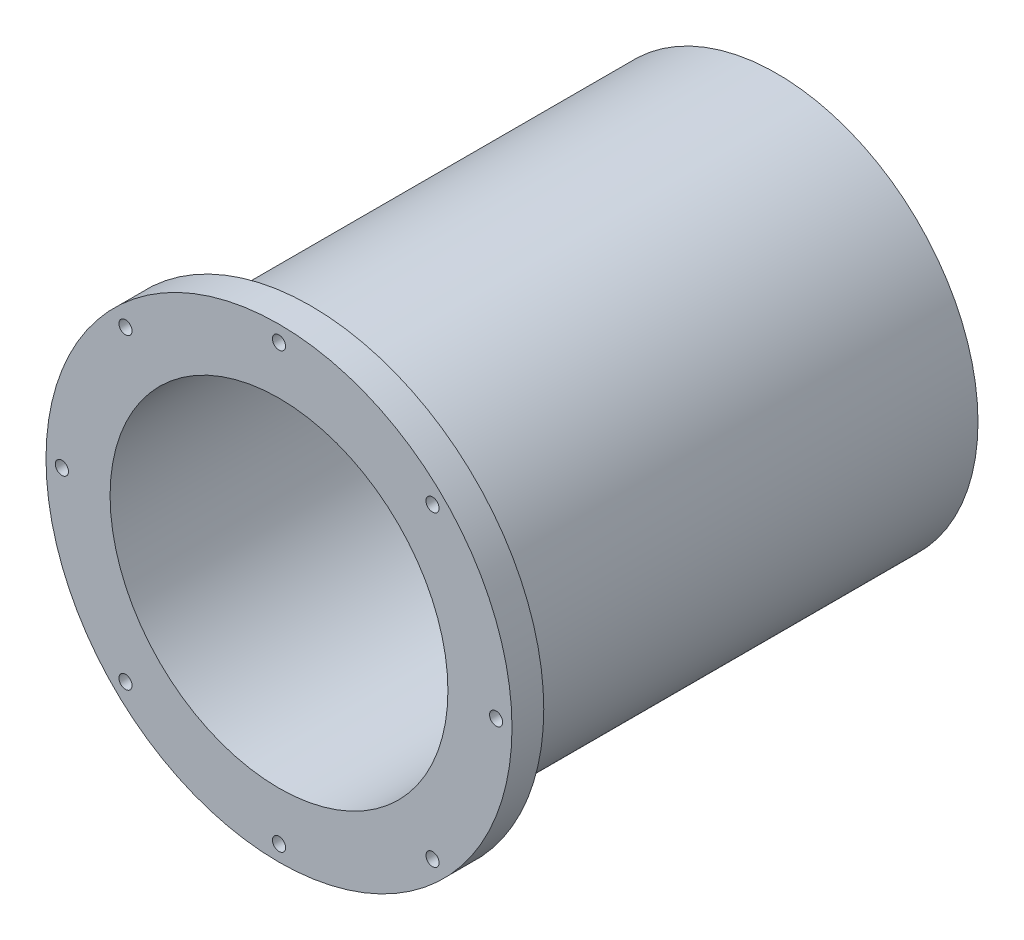
ISO-10303-21;
HEADER;
FILE_DESCRIPTION(('STEP AP214'),'2;1');
FILE_NAME('part.step','',(''),(''),'','','');
FILE_SCHEMA(('AUTOMOTIVE_DESIGN { 1 0 10303 214 1 1 1 1 }'));
ENDSEC;
DATA;
#1=APPLICATION_CONTEXT('core data for automotive mechanical design processes');
#2=APPLICATION_PROTOCOL_DEFINITION('international standard','automotive_design',2000,#1);
#3=PRODUCT_CONTEXT('',#1,'mechanical');
#4=PRODUCT('Part','Part','',(#3));
#5=PRODUCT_RELATED_PRODUCT_CATEGORY('part','',(#4));
#6=PRODUCT_DEFINITION_FORMATION('','',#4);
#7=PRODUCT_DEFINITION_CONTEXT('part definition',#1,'design');
#8=PRODUCT_DEFINITION('design','',#6,#7);
#9=PRODUCT_DEFINITION_SHAPE('','',#8);
#10=(LENGTH_UNIT() NAMED_UNIT(*) SI_UNIT(.MILLI.,.METRE.));
#11=(NAMED_UNIT(*) PLANE_ANGLE_UNIT() SI_UNIT($,.RADIAN.));
#12=(NAMED_UNIT(*) SI_UNIT($,.STERADIAN.) SOLID_ANGLE_UNIT());
#13=UNCERTAINTY_MEASURE_WITH_UNIT(LENGTH_MEASURE(1.E-05),#10,'distance_accuracy_value','');
#14=(GEOMETRIC_REPRESENTATION_CONTEXT(3) GLOBAL_UNCERTAINTY_ASSIGNED_CONTEXT((#13)) GLOBAL_UNIT_ASSIGNED_CONTEXT((#10,
#11,#12)) REPRESENTATION_CONTEXT('',''));
#15=CARTESIAN_POINT('',(0.,0.,0.));
#16=DIRECTION('',(0.,0.,1.));
#17=DIRECTION('',(1.,0.,0.));
#18=AXIS2_PLACEMENT_3D('',#15,#16,#17);
#19=CARTESIAN_POINT('',(0.,0.,11.));
#20=DIRECTION('',(0.,0.,-1.));
#21=DIRECTION('',(-1.,0.,0.));
#22=AXIS2_PLACEMENT_3D('',#19,#20,#21);
#23=CYLINDRICAL_SURFACE('',#22,55.);
#24=CARTESIAN_POINT('',(0.,0.,11.));
#25=DIRECTION('',(0.,0.,1.));
#26=DIRECTION('',(1.,0.,0.));
#27=AXIS2_PLACEMENT_3D('',#24,#25,#26);
#28=CIRCLE('',#27,55.);
#29=CARTESIAN_POINT('',(55.,0.,11.));
#30=VERTEX_POINT('',#29);
#31=EDGE_CURVE('E11',#30,#30,#28,.T.);
#32=ORIENTED_EDGE('',*,*,#31,.F.);
#33=EDGE_LOOP('',(#32));
#34=FACE_BOUND('',#33,.T.);
#35=CARTESIAN_POINT('',(0.,0.,3.5));
#36=DIRECTION('',(0.,0.,-1.));
#37=DIRECTION('',(-1.,0.,0.));
#38=AXIS2_PLACEMENT_3D('',#35,#36,#37);
#39=CIRCLE('',#38,55.);
#40=CARTESIAN_POINT('',(-55.,0.,3.5));
#41=VERTEX_POINT('',#40);
#42=EDGE_CURVE('E41',#41,#41,#39,.T.);
#43=ORIENTED_EDGE('',*,*,#42,.F.);
#44=EDGE_LOOP('',(#43));
#45=FACE_BOUND('',#44,.T.);
#46=ADVANCED_FACE('F36',(#34,#45),#23,.T.);
#47=CARTESIAN_POINT('',(0.,0.,11.));
#48=DIRECTION('',(0.,0.,1.));
#49=DIRECTION('',(1.,0.,0.));
#50=AXIS2_PLACEMENT_3D('',#47,#48,#49);
#51=PLANE('',#50);
#52=CARTESIAN_POINT('',(0.,0.,11.));
#53=DIRECTION('',(0.,0.,1.));
#54=DIRECTION('',(1.,0.,0.));
#55=AXIS2_PLACEMENT_3D('',#52,#53,#54);
#56=CIRCLE('',#55,39.875);
#57=CARTESIAN_POINT('',(39.875,0.,11.));
#58=VERTEX_POINT('',#57);
#59=EDGE_CURVE('E91',#58,#58,#56,.T.);
#60=ORIENTED_EDGE('',*,*,#59,.F.);
#61=EDGE_LOOP('',(#60));
#62=FACE_BOUND('',#61,.T.);
#63=CARTESIAN_POINT('',(51.25,-1.78938418615711E-13,11.));
#64=DIRECTION('',(0.,0.,-1.));
#65=DIRECTION('',(0.,1.,0.));
#66=AXIS2_PLACEMENT_3D('',#63,#64,#65);
#67=CIRCLE('',#66,1.55);
#68=CARTESIAN_POINT('',(51.25,1.54999999999982,11.));
#69=VERTEX_POINT('',#68);
#70=EDGE_CURVE('E65',#69,#69,#67,.T.);
#71=ORIENTED_EDGE('',*,*,#70,.T.);
#72=EDGE_LOOP('',(#71));
#73=FACE_BOUND('',#72,.T.);
#74=CARTESIAN_POINT('',(36.2392225358104,-36.2392225358108,11.));
#75=DIRECTION('',(0.,0.,-1.));
#76=DIRECTION('',(0.707106781186551,0.707106781186544,0.));
#77=AXIS2_PLACEMENT_3D('',#74,#75,#76);
#78=CIRCLE('',#77,1.55);
#79=CARTESIAN_POINT('',(37.3352380466495,-35.1432070249716,11.));
#80=VERTEX_POINT('',#79);
#81=EDGE_CURVE('E82',#80,#80,#78,.T.);
#82=ORIENTED_EDGE('',*,*,#81,.T.);
#83=EDGE_LOOP('',(#82));
#84=FACE_BOUND('',#83,.T.);
#85=CARTESIAN_POINT('',(0.,-51.25,11.));
#86=DIRECTION('',(0.,0.,-1.));
#87=DIRECTION('',(1.,0.,0.));
#88=AXIS2_PLACEMENT_3D('',#85,#86,#87);
#89=CIRCLE('',#88,1.55);
#90=CARTESIAN_POINT('',(1.55,-51.25,11.));
#91=VERTEX_POINT('',#90);
#92=EDGE_CURVE('E73',#91,#91,#89,.T.);
#93=ORIENTED_EDGE('',*,*,#92,.T.);
#94=EDGE_LOOP('',(#93));
#95=FACE_BOUND('',#94,.T.);
#96=CARTESIAN_POINT('',(-36.2392225358109,-36.2392225358102,11.));
#97=DIRECTION('',(0.,0.,-1.));
#98=DIRECTION('',(0.707106781186541,-0.707106781186554,0.));
#99=AXIS2_PLACEMENT_3D('',#96,#97,#98);
#100=CIRCLE('',#99,1.55);
#101=CARTESIAN_POINT('',(-35.1432070249717,-37.3352380466494,11.));
#102=VERTEX_POINT('',#101);
#103=EDGE_CURVE('E68',#102,#102,#100,.T.);
#104=ORIENTED_EDGE('',*,*,#103,.T.);
#105=EDGE_LOOP('',(#104));
#106=FACE_BOUND('',#105,.T.);
#107=CARTESIAN_POINT('',(-51.25,5.36815255847132E-13,11.));
#108=DIRECTION('',(0.,0.,-1.));
#109=DIRECTION('',(0.,-1.,0.));
#110=AXIS2_PLACEMENT_3D('',#107,#108,#109);
#111=CIRCLE('',#110,1.55);
#112=CARTESIAN_POINT('',(-51.25,-1.54999999999946,11.));
#113=VERTEX_POINT('',#112);
#114=EDGE_CURVE('E69',#113,#113,#111,.T.);
#115=ORIENTED_EDGE('',*,*,#114,.T.);
#116=EDGE_LOOP('',(#115));
#117=FACE_BOUND('',#116,.T.);
#118=CARTESIAN_POINT('',(-36.2392225358101,36.239222535811,11.));
#119=DIRECTION('',(0.,0.,-1.));
#120=DIRECTION('',(-0.707106781186556,-0.707106781186539,0.));
#121=AXIS2_PLACEMENT_3D('',#118,#119,#120);
#122=CIRCLE('',#121,1.55);
#123=CARTESIAN_POINT('',(-37.3352380466493,35.1432070249719,11.));
#124=VERTEX_POINT('',#123);
#125=EDGE_CURVE('E95',#124,#124,#122,.T.);
#126=ORIENTED_EDGE('',*,*,#125,.T.);
#127=EDGE_LOOP('',(#126));
#128=FACE_BOUND('',#127,.T.);
#129=CARTESIAN_POINT('',(36.2392225358106,36.2392225358105,11.));
#130=DIRECTION('',(0.,0.,-1.));
#131=DIRECTION('',(-0.707106781186546,0.707106781186549,0.));
#132=AXIS2_PLACEMENT_3D('',#129,#130,#131);
#133=CIRCLE('',#132,1.55);
#134=CARTESIAN_POINT('',(35.1432070249715,37.3352380466497,11.));
#135=VERTEX_POINT('',#134);
#136=EDGE_CURVE('E57',#135,#135,#133,.T.);
#137=ORIENTED_EDGE('',*,*,#136,.T.);
#138=EDGE_LOOP('',(#137));
#139=FACE_BOUND('',#138,.T.);
#140=CARTESIAN_POINT('',(0.,51.25,11.));
#141=DIRECTION('',(0.,0.,-1.));
#142=DIRECTION('',(-1.,0.,0.));
#143=AXIS2_PLACEMENT_3D('',#140,#141,#142);
#144=CIRCLE('',#143,1.55);
#145=CARTESIAN_POINT('',(-1.55,51.25,11.));
#146=VERTEX_POINT('',#145);
#147=EDGE_CURVE('E55',#146,#146,#144,.T.);
#148=ORIENTED_EDGE('',*,*,#147,.T.);
#149=EDGE_LOOP('',(#148));
#150=FACE_BOUND('',#149,.T.);
#151=ORIENTED_EDGE('',*,*,#31,.T.);
#152=EDGE_LOOP('',(#151));
#153=FACE_BOUND('',#152,.T.);
#154=ADVANCED_FACE('F123',(#62,#73,#84,#95,#106,#117,#128,#139,#150,#153),#51,.T.);
#155=CARTESIAN_POINT('',(0.,0.,3.5));
#156=DIRECTION('',(0.,0.,-1.));
#157=DIRECTION('',(-1.,0.,0.));
#158=AXIS2_PLACEMENT_3D('',#155,#156,#157);
#159=PLANE('',#158);
#160=CARTESIAN_POINT('',(51.25,-1.78938418615711E-13,3.5));
#161=DIRECTION('',(0.,0.,-1.));
#162=DIRECTION('',(0.,1.,0.));
#163=AXIS2_PLACEMENT_3D('',#160,#161,#162);
#164=CIRCLE('',#163,1.55);
#165=CARTESIAN_POINT('',(51.25,1.54999999999982,3.5));
#166=VERTEX_POINT('',#165);
#167=EDGE_CURVE('E84',#166,#166,#164,.T.);
#168=ORIENTED_EDGE('',*,*,#167,.F.);
#169=EDGE_LOOP('',(#168));
#170=FACE_BOUND('',#169,.T.);
#171=CARTESIAN_POINT('',(36.2392225358104,-36.2392225358108,3.5));
#172=DIRECTION('',(0.,0.,-1.));
#173=DIRECTION('',(0.707106781186551,0.707106781186544,0.));
#174=AXIS2_PLACEMENT_3D('',#171,#172,#173);
#175=CIRCLE('',#174,1.55);
#176=CARTESIAN_POINT('',(37.3352380466495,-35.1432070249716,3.5));
#177=VERTEX_POINT('',#176);
#178=EDGE_CURVE('E78',#177,#177,#175,.T.);
#179=ORIENTED_EDGE('',*,*,#178,.F.);
#180=EDGE_LOOP('',(#179));
#181=FACE_BOUND('',#180,.T.);
#182=CARTESIAN_POINT('',(0.,-51.25,3.5));
#183=DIRECTION('',(0.,0.,-1.));
#184=DIRECTION('',(1.,0.,0.));
#185=AXIS2_PLACEMENT_3D('',#182,#183,#184);
#186=CIRCLE('',#185,1.55);
#187=CARTESIAN_POINT('',(1.55,-51.25,3.5));
#188=VERTEX_POINT('',#187);
#189=EDGE_CURVE('E75',#188,#188,#186,.T.);
#190=ORIENTED_EDGE('',*,*,#189,.F.);
#191=EDGE_LOOP('',(#190));
#192=FACE_BOUND('',#191,.T.);
#193=CARTESIAN_POINT('',(-36.2392225358109,-36.2392225358102,3.5));
#194=DIRECTION('',(0.,0.,-1.));
#195=DIRECTION('',(0.707106781186541,-0.707106781186554,0.));
#196=AXIS2_PLACEMENT_3D('',#193,#194,#195);
#197=CIRCLE('',#196,1.55);
#198=CARTESIAN_POINT('',(-35.1432070249717,-37.3352380466494,3.5));
#199=VERTEX_POINT('',#198);
#200=EDGE_CURVE('E61',#199,#199,#197,.T.);
#201=ORIENTED_EDGE('',*,*,#200,.F.);
#202=EDGE_LOOP('',(#201));
#203=FACE_BOUND('',#202,.T.);
#204=CARTESIAN_POINT('',(-51.25,5.36815255847132E-13,3.5));
#205=DIRECTION('',(0.,0.,-1.));
#206=DIRECTION('',(0.,-1.,0.));
#207=AXIS2_PLACEMENT_3D('',#204,#205,#206);
#208=CIRCLE('',#207,1.55);
#209=CARTESIAN_POINT('',(-51.25,-1.54999999999946,3.5));
#210=VERTEX_POINT('',#209);
#211=EDGE_CURVE('E96',#210,#210,#208,.T.);
#212=ORIENTED_EDGE('',*,*,#211,.F.);
#213=EDGE_LOOP('',(#212));
#214=FACE_BOUND('',#213,.T.);
#215=CARTESIAN_POINT('',(-36.2392225358101,36.239222535811,3.5));
#216=DIRECTION('',(0.,0.,-1.));
#217=DIRECTION('',(-0.707106781186556,-0.707106781186539,0.));
#218=AXIS2_PLACEMENT_3D('',#215,#216,#217);
#219=CIRCLE('',#218,1.55);
#220=CARTESIAN_POINT('',(-37.3352380466493,35.1432070249719,3.5));
#221=VERTEX_POINT('',#220);
#222=EDGE_CURVE('E90',#221,#221,#219,.T.);
#223=ORIENTED_EDGE('',*,*,#222,.F.);
#224=EDGE_LOOP('',(#223));
#225=FACE_BOUND('',#224,.T.);
#226=CARTESIAN_POINT('',(36.2392225358106,36.2392225358105,3.5));
#227=DIRECTION('',(0.,0.,-1.));
#228=DIRECTION('',(-0.707106781186546,0.707106781186549,0.));
#229=AXIS2_PLACEMENT_3D('',#226,#227,#228);
#230=CIRCLE('',#229,1.55);
#231=CARTESIAN_POINT('',(35.1432070249715,37.3352380466497,3.5));
#232=VERTEX_POINT('',#231);
#233=EDGE_CURVE('E56',#232,#232,#230,.T.);
#234=ORIENTED_EDGE('',*,*,#233,.F.);
#235=EDGE_LOOP('',(#234));
#236=FACE_BOUND('',#235,.T.);
#237=CARTESIAN_POINT('',(0.,51.25,3.5));
#238=DIRECTION('',(0.,0.,-1.));
#239=DIRECTION('',(-1.,0.,0.));
#240=AXIS2_PLACEMENT_3D('',#237,#238,#239);
#241=CIRCLE('',#240,1.55);
#242=CARTESIAN_POINT('',(-1.55,51.25,3.5));
#243=VERTEX_POINT('',#242);
#244=EDGE_CURVE('E52',#243,#243,#241,.T.);
#245=ORIENTED_EDGE('',*,*,#244,.F.);
#246=EDGE_LOOP('',(#245));
#247=FACE_BOUND('',#246,.T.);
#248=CARTESIAN_POINT('',(0.,0.,3.5));
#249=DIRECTION('',(0.,0.,-1.));
#250=DIRECTION('',(-1.,0.,0.));
#251=AXIS2_PLACEMENT_3D('',#248,#249,#250);
#252=CIRCLE('',#251,47.5);
#253=CARTESIAN_POINT('',(-47.5,0.,3.5));
#254=VERTEX_POINT('',#253);
#255=EDGE_CURVE('E48',#254,#254,#252,.T.);
#256=ORIENTED_EDGE('',*,*,#255,.F.);
#257=EDGE_LOOP('',(#256));
#258=FACE_BOUND('',#257,.T.);
#259=ORIENTED_EDGE('',*,*,#42,.T.);
#260=EDGE_LOOP('',(#259));
#261=FACE_BOUND('',#260,.T.);
#262=ADVANCED_FACE('F129',(#170,#181,#192,#203,#214,#225,#236,#247,#258,#261),#159,.T.);
#263=CARTESIAN_POINT('',(0.,0.,3.5));
#264=DIRECTION('',(0.,0.,-1.));
#265=DIRECTION('',(-1.,0.,0.));
#266=AXIS2_PLACEMENT_3D('',#263,#264,#265);
#267=CYLINDRICAL_SURFACE('',#266,47.5);
#268=CARTESIAN_POINT('',(0.,0.,-106.5));
#269=DIRECTION('',(0.,0.,-1.));
#270=DIRECTION('',(-1.,0.,0.));
#271=AXIS2_PLACEMENT_3D('',#268,#269,#270);
#272=CIRCLE('',#271,47.5);
#273=CARTESIAN_POINT('',(-47.5,0.,-106.5));
#274=VERTEX_POINT('',#273);
#275=EDGE_CURVE('E103',#274,#274,#272,.T.);
#276=CARTESIAN_POINT('',(-47.5,0.,3.5));
#277=CARTESIAN_POINT('',(-47.5,0.,2.35416666666667));
#278=CARTESIAN_POINT('',(-47.5,0.,1.20833333333334));
#279=CARTESIAN_POINT('',(-47.5,0.,-1.08333333333333));
#280=CARTESIAN_POINT('',(-47.5,0.,-2.22916666666666));
#281=CARTESIAN_POINT('',(-47.5,0.,-4.52083333333333));
#282=CARTESIAN_POINT('',(-47.5,0.,-5.66666666666667));
#283=CARTESIAN_POINT('',(-47.5,0.,-7.95833333333333));
#284=CARTESIAN_POINT('',(-47.5,0.,-9.10416666666666));
#285=CARTESIAN_POINT('',(-47.5,0.,-11.3958333333333));
#286=CARTESIAN_POINT('',(-47.5,0.,-12.5416666666667));
#287=CARTESIAN_POINT('',(-47.5,0.,-14.8333333333333));
#288=CARTESIAN_POINT('',(-47.5,0.,-15.9791666666667));
#289=CARTESIAN_POINT('',(-47.5,0.,-18.2708333333333));
#290=CARTESIAN_POINT('',(-47.5,0.,-19.4166666666667));
#291=CARTESIAN_POINT('',(-47.5,0.,-21.7083333333333));
#292=CARTESIAN_POINT('',(-47.5,0.,-22.8541666666667));
#293=CARTESIAN_POINT('',(-47.5,0.,-25.1458333333333));
#294=CARTESIAN_POINT('',(-47.5,0.,-26.2916666666667));
#295=CARTESIAN_POINT('',(-47.5,0.,-28.5833333333333));
#296=CARTESIAN_POINT('',(-47.5,0.,-29.7291666666667));
#297=CARTESIAN_POINT('',(-47.5,0.,-32.0208333333333));
#298=CARTESIAN_POINT('',(-47.5,0.,-33.1666666666667));
#299=CARTESIAN_POINT('',(-47.5,0.,-35.4583333333333));
#300=CARTESIAN_POINT('',(-47.5,0.,-36.6041666666667));
#301=CARTESIAN_POINT('',(-47.5,0.,-38.8958333333333));
#302=CARTESIAN_POINT('',(-47.5,0.,-40.0416666666667));
#303=CARTESIAN_POINT('',(-47.5,0.,-42.3333333333333));
#304=CARTESIAN_POINT('',(-47.5,0.,-43.4791666666667));
#305=CARTESIAN_POINT('',(-47.5,0.,-45.7708333333333));
#306=CARTESIAN_POINT('',(-47.5,0.,-46.9166666666667));
#307=CARTESIAN_POINT('',(-47.5,0.,-49.2083333333333));
#308=CARTESIAN_POINT('',(-47.5,0.,-50.3541666666667));
#309=CARTESIAN_POINT('',(-47.5,0.,-52.6458333333333));
#310=CARTESIAN_POINT('',(-47.5,0.,-53.7916666666667));
#311=CARTESIAN_POINT('',(-47.5,0.,-56.0833333333333));
#312=CARTESIAN_POINT('',(-47.5,0.,-57.2291666666667));
#313=CARTESIAN_POINT('',(-47.5,0.,-59.5208333333333));
#314=CARTESIAN_POINT('',(-47.5,0.,-60.6666666666667));
#315=CARTESIAN_POINT('',(-47.5,0.,-62.9583333333333));
#316=CARTESIAN_POINT('',(-47.5,0.,-64.1041666666667));
#317=CARTESIAN_POINT('',(-47.5,0.,-66.3958333333333));
#318=CARTESIAN_POINT('',(-47.5,0.,-67.5416666666667));
#319=CARTESIAN_POINT('',(-47.5,0.,-69.8333333333333));
#320=CARTESIAN_POINT('',(-47.5,0.,-70.9791666666667));
#321=CARTESIAN_POINT('',(-47.5,0.,-73.2708333333333));
#322=CARTESIAN_POINT('',(-47.5,0.,-74.4166666666667));
#323=CARTESIAN_POINT('',(-47.5,0.,-76.7083333333333));
#324=CARTESIAN_POINT('',(-47.5,0.,-77.8541666666667));
#325=CARTESIAN_POINT('',(-47.5,0.,-80.1458333333333));
#326=CARTESIAN_POINT('',(-47.5,0.,-81.2916666666667));
#327=CARTESIAN_POINT('',(-47.5,0.,-83.5833333333333));
#328=CARTESIAN_POINT('',(-47.5,0.,-84.7291666666667));
#329=CARTESIAN_POINT('',(-47.5,0.,-87.0208333333333));
#330=CARTESIAN_POINT('',(-47.5,0.,-88.1666666666667));
#331=CARTESIAN_POINT('',(-47.5,0.,-90.4583333333333));
#332=CARTESIAN_POINT('',(-47.5,0.,-91.6041666666667));
#333=CARTESIAN_POINT('',(-47.5,0.,-93.8958333333333));
#334=CARTESIAN_POINT('',(-47.5,0.,-95.0416666666667));
#335=CARTESIAN_POINT('',(-47.5,0.,-97.3333333333333));
#336=CARTESIAN_POINT('',(-47.5,0.,-98.4791666666667));
#337=CARTESIAN_POINT('',(-47.5,0.,-100.770833333333));
#338=CARTESIAN_POINT('',(-47.5,0.,-101.916666666667));
#339=CARTESIAN_POINT('',(-47.5,0.,-104.208333333333));
#340=CARTESIAN_POINT('',(-47.5,0.,-105.354166666667));
#341=CARTESIAN_POINT('',(-47.5,0.,-106.5));
#342=B_SPLINE_CURVE_WITH_KNOTS('',3,(#276,#277,#278,#279,#280,#281,#282,#283,#284,#285,#286,
#287,#288,#289,#290,#291,#292,#293,#294,#295,#296,#297,#298,#299,#300,#301,#302,#303,#304,#305,
#306,#307,#308,#309,#310,#311,#312,#313,#314,#315,#316,#317,#318,#319,#320,#321,#322,#323,#324,
#325,#326,#327,#328,#329,#330,#331,#332,#333,#334,#335,#336,#337,#338,#339,#340,#341),
.UNSPECIFIED.,.F.,.F.,(4,2,2,2,2,2,2,2,2,2,2,2,2,2,2,2,2,2,2,2,2,2,2,2,2,2,2,2,2,2,2,2,4),(0.,
3.4375,6.875,10.3125,13.75,17.1875,20.625,24.0625,27.5,30.9375,34.375,37.8125,41.25,44.6875,
48.125,51.5625,55.,58.4375,61.875,65.3125,68.75,72.1875,75.625,79.0625,82.5,85.9375,89.375,
92.8125,96.25,99.6875,103.125,106.5625,110.),.UNSPECIFIED.);
#343=EDGE_CURVE('BSEAM131',#254,#274,#342,.T.);
#344=ORIENTED_EDGE('',*,*,#255,.T.);
#345=ORIENTED_EDGE('',*,*,#275,.F.);
#346=ORIENTED_EDGE('',*,*,#343,.T.);
#347=ORIENTED_EDGE('',*,*,#343,.F.);
#348=EDGE_LOOP('',(#344,#346,#345,#347));
#349=FACE_BOUND('',#348,.T.);
#350=ADVANCED_FACE('F131',(#349),#267,.T.);
#351=CARTESIAN_POINT('',(0.,51.25,11.));
#352=DIRECTION('',(0.,0.,-1.));
#353=DIRECTION('',(-1.,0.,0.));
#354=AXIS2_PLACEMENT_3D('',#351,#352,#353);
#355=CYLINDRICAL_SURFACE('',#354,1.55);
#356=ORIENTED_EDGE('',*,*,#147,.F.);
#357=EDGE_LOOP('',(#356));
#358=FACE_BOUND('',#357,.T.);
#359=ORIENTED_EDGE('',*,*,#244,.T.);
#360=EDGE_LOOP('',(#359));
#361=FACE_BOUND('',#360,.T.);
#362=ADVANCED_FACE('F142',(#358,#361),#355,.F.);
#363=CARTESIAN_POINT('',(36.2392225358106,36.2392225358105,11.));
#364=DIRECTION('',(0.,0.,-1.));
#365=DIRECTION('',(-1.,0.,0.));
#366=AXIS2_PLACEMENT_3D('',#363,#364,#365);
#367=CYLINDRICAL_SURFACE('',#366,1.55);
#368=ORIENTED_EDGE('',*,*,#136,.F.);
#369=EDGE_LOOP('',(#368));
#370=FACE_BOUND('',#369,.T.);
#371=ORIENTED_EDGE('',*,*,#233,.T.);
#372=EDGE_LOOP('',(#371));
#373=FACE_BOUND('',#372,.T.);
#374=ADVANCED_FACE('F149',(#370,#373),#367,.F.);
#375=CARTESIAN_POINT('',(-36.2392225358101,36.239222535811,11.));
#376=DIRECTION('',(0.,0.,-1.));
#377=DIRECTION('',(-1.,0.,0.));
#378=AXIS2_PLACEMENT_3D('',#375,#376,#377);
#379=CYLINDRICAL_SURFACE('',#378,1.55);
#380=ORIENTED_EDGE('',*,*,#125,.F.);
#381=EDGE_LOOP('',(#380));
#382=FACE_BOUND('',#381,.T.);
#383=ORIENTED_EDGE('',*,*,#222,.T.);
#384=EDGE_LOOP('',(#383));
#385=FACE_BOUND('',#384,.T.);
#386=ADVANCED_FACE('F155',(#382,#385),#379,.F.);
#387=CARTESIAN_POINT('',(-51.25,5.36815255847132E-13,11.));
#388=DIRECTION('',(0.,0.,-1.));
#389=DIRECTION('',(-1.,0.,0.));
#390=AXIS2_PLACEMENT_3D('',#387,#388,#389);
#391=CYLINDRICAL_SURFACE('',#390,1.55);
#392=ORIENTED_EDGE('',*,*,#114,.F.);
#393=EDGE_LOOP('',(#392));
#394=FACE_BOUND('',#393,.T.);
#395=ORIENTED_EDGE('',*,*,#211,.T.);
#396=EDGE_LOOP('',(#395));
#397=FACE_BOUND('',#396,.T.);
#398=ADVANCED_FACE('F158',(#394,#397),#391,.F.);
#399=CARTESIAN_POINT('',(-36.2392225358109,-36.2392225358102,11.));
#400=DIRECTION('',(0.,0.,-1.));
#401=DIRECTION('',(-1.,0.,0.));
#402=AXIS2_PLACEMENT_3D('',#399,#400,#401);
#403=CYLINDRICAL_SURFACE('',#402,1.55);
#404=ORIENTED_EDGE('',*,*,#103,.F.);
#405=EDGE_LOOP('',(#404));
#406=FACE_BOUND('',#405,.T.);
#407=ORIENTED_EDGE('',*,*,#200,.T.);
#408=EDGE_LOOP('',(#407));
#409=FACE_BOUND('',#408,.T.);
#410=ADVANCED_FACE('F152',(#406,#409),#403,.F.);
#411=CARTESIAN_POINT('',(0.,-51.25,11.));
#412=DIRECTION('',(0.,0.,-1.));
#413=DIRECTION('',(-1.,0.,0.));
#414=AXIS2_PLACEMENT_3D('',#411,#412,#413);
#415=CYLINDRICAL_SURFACE('',#414,1.55);
#416=ORIENTED_EDGE('',*,*,#92,.F.);
#417=EDGE_LOOP('',(#416));
#418=FACE_BOUND('',#417,.T.);
#419=ORIENTED_EDGE('',*,*,#189,.T.);
#420=EDGE_LOOP('',(#419));
#421=FACE_BOUND('',#420,.T.);
#422=ADVANCED_FACE('F160',(#418,#421),#415,.F.);
#423=CARTESIAN_POINT('',(36.2392225358104,-36.2392225358108,11.));
#424=DIRECTION('',(0.,0.,-1.));
#425=DIRECTION('',(-1.,0.,0.));
#426=AXIS2_PLACEMENT_3D('',#423,#424,#425);
#427=CYLINDRICAL_SURFACE('',#426,1.55);
#428=ORIENTED_EDGE('',*,*,#81,.F.);
#429=EDGE_LOOP('',(#428));
#430=FACE_BOUND('',#429,.T.);
#431=ORIENTED_EDGE('',*,*,#178,.T.);
#432=EDGE_LOOP('',(#431));
#433=FACE_BOUND('',#432,.T.);
#434=ADVANCED_FACE('F165',(#430,#433),#427,.F.);
#435=CARTESIAN_POINT('',(51.25,-1.78938418615711E-13,11.));
#436=DIRECTION('',(0.,0.,-1.));
#437=DIRECTION('',(-1.,0.,0.));
#438=AXIS2_PLACEMENT_3D('',#435,#436,#437);
#439=CYLINDRICAL_SURFACE('',#438,1.55);
#440=ORIENTED_EDGE('',*,*,#70,.F.);
#441=EDGE_LOOP('',(#440));
#442=FACE_BOUND('',#441,.T.);
#443=ORIENTED_EDGE('',*,*,#167,.T.);
#444=EDGE_LOOP('',(#443));
#445=FACE_BOUND('',#444,.T.);
#446=ADVANCED_FACE('F119',(#442,#445),#439,.F.);
#447=CARTESIAN_POINT('',(0.,0.,-11.));
#448=DIRECTION('',(0.,0.,1.));
#449=DIRECTION('',(1.,0.,0.));
#450=AXIS2_PLACEMENT_3D('',#447,#448,#449);
#451=CYLINDRICAL_SURFACE('',#450,39.875);
#452=ORIENTED_EDGE('',*,*,#59,.T.);
#453=EDGE_LOOP('',(#452));
#454=FACE_BOUND('',#453,.T.);
#455=CARTESIAN_POINT('',(0.,0.,-106.5));
#456=DIRECTION('',(0.,0.,-1.));
#457=DIRECTION('',(-1.,0.,0.));
#458=AXIS2_PLACEMENT_3D('',#455,#456,#457);
#459=CIRCLE('',#458,39.875);
#460=CARTESIAN_POINT('',(-39.875,0.,-106.5));
#461=VERTEX_POINT('',#460);
#462=EDGE_CURVE('E106',#461,#461,#459,.T.);
#463=ORIENTED_EDGE('',*,*,#462,.T.);
#464=EDGE_LOOP('',(#463));
#465=FACE_BOUND('',#464,.T.);
#466=ADVANCED_FACE('F109',(#454,#465),#451,.F.);
#467=CARTESIAN_POINT('',(0.,0.,-106.5));
#468=DIRECTION('',(0.,0.,-1.));
#469=DIRECTION('',(-1.,0.,0.));
#470=AXIS2_PLACEMENT_3D('',#467,#468,#469);
#471=PLANE('',#470);
#472=ORIENTED_EDGE('',*,*,#275,.T.);
#473=EDGE_LOOP('',(#472));
#474=FACE_BOUND('',#473,.T.);
#475=ORIENTED_EDGE('',*,*,#462,.F.);
#476=EDGE_LOOP('',(#475));
#477=FACE_BOUND('',#476,.T.);
#478=ADVANCED_FACE('F115',(#474,#477),#471,.T.);
#479=CLOSED_SHELL('',(#46,#154,#262,#350,#362,#374,#386,#398,#410,#422,#434,#446,#466,#478));
#480=MANIFOLD_SOLID_BREP('B2',#479);
#481=ADVANCED_BREP_SHAPE_REPRESENTATION('',(#18,#480),#14);
#482=SHAPE_DEFINITION_REPRESENTATION(#9,#481);
ENDSEC;
END-ISO-10303-21;
